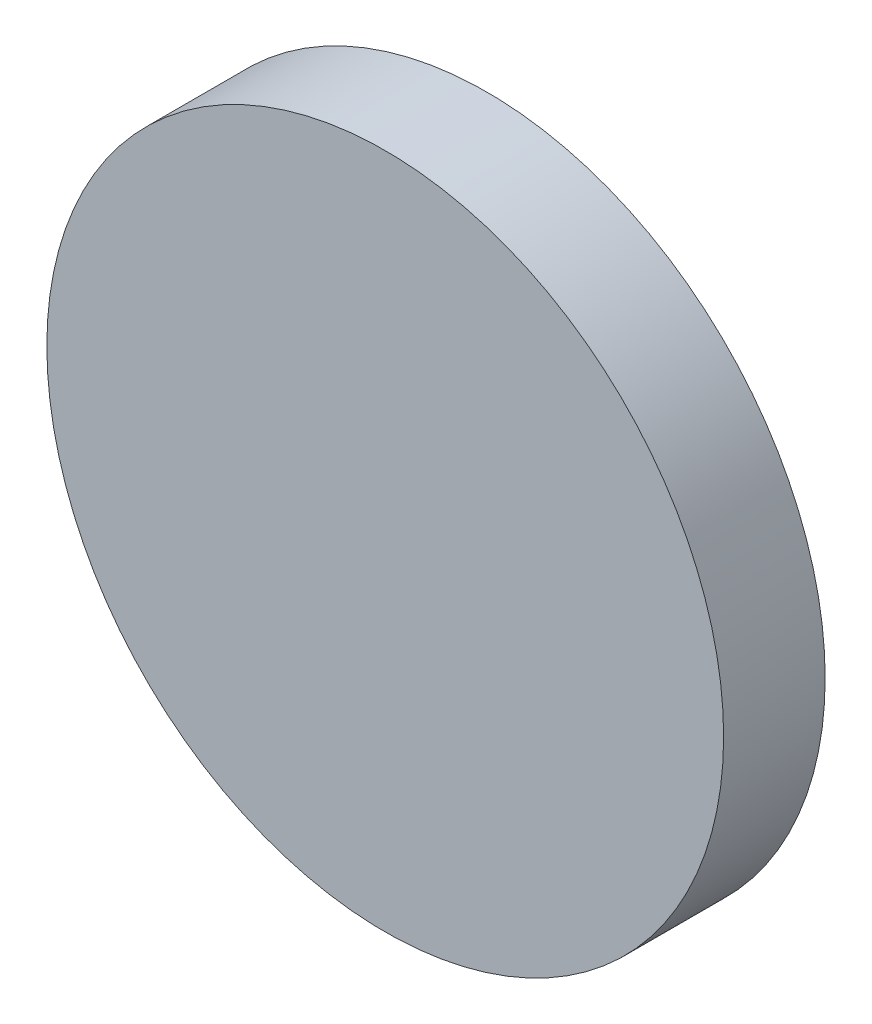
ISO-10303-21;
HEADER;
FILE_DESCRIPTION(('STEP AP214'),'2;1');
FILE_NAME('part.step','',(''),(''),'','','');
FILE_SCHEMA(('AUTOMOTIVE_DESIGN { 1 0 10303 214 1 1 1 1 }'));
ENDSEC;
DATA;
#1=APPLICATION_CONTEXT('core data for automotive mechanical design processes');
#2=APPLICATION_PROTOCOL_DEFINITION('international standard','automotive_design',2000,#1);
#3=PRODUCT_CONTEXT('',#1,'mechanical');
#4=PRODUCT('Part','Part','',(#3));
#5=PRODUCT_RELATED_PRODUCT_CATEGORY('part','',(#4));
#6=PRODUCT_DEFINITION_FORMATION('','',#4);
#7=PRODUCT_DEFINITION_CONTEXT('part definition',#1,'design');
#8=PRODUCT_DEFINITION('design','',#6,#7);
#9=PRODUCT_DEFINITION_SHAPE('','',#8);
#10=(LENGTH_UNIT() NAMED_UNIT(*) SI_UNIT(.MILLI.,.METRE.));
#11=(NAMED_UNIT(*) PLANE_ANGLE_UNIT() SI_UNIT($,.RADIAN.));
#12=(NAMED_UNIT(*) SI_UNIT($,.STERADIAN.) SOLID_ANGLE_UNIT());
#13=UNCERTAINTY_MEASURE_WITH_UNIT(LENGTH_MEASURE(1.E-05),#10,'distance_accuracy_value','');
#14=(GEOMETRIC_REPRESENTATION_CONTEXT(3) GLOBAL_UNCERTAINTY_ASSIGNED_CONTEXT((#13)) GLOBAL_UNIT_ASSIGNED_CONTEXT((#10,
#11,#12)) REPRESENTATION_CONTEXT('',''));
#15=CARTESIAN_POINT('',(0.,0.,0.));
#16=DIRECTION('',(0.,0.,1.));
#17=DIRECTION('',(1.,0.,0.));
#18=AXIS2_PLACEMENT_3D('',#15,#16,#17);
#19=CARTESIAN_POINT('',(-1.66533453693773E-13,0.,3.));
#20=DIRECTION('',(0.,0.,-1.));
#21=DIRECTION('',(-1.00000000000002,0.,0.));
#22=AXIS2_PLACEMENT_3D('',#19,#20,#21);
#23=CYLINDRICAL_SURFACE('',#22,10.);
#24=CARTESIAN_POINT('',(-1.66533453693773E-13,0.,3.));
#25=DIRECTION('',(0.,0.,1.));
#26=DIRECTION('',(1.00000000000002,0.,0.));
#27=AXIS2_PLACEMENT_3D('',#24,#25,#26);
#28=CIRCLE('',#27,10.);
#29=CARTESIAN_POINT('',(10.0000000000001,0.,3.));
#30=VERTEX_POINT('',#29);
#31=EDGE_CURVE('E10',#30,#30,#28,.T.);
#32=ORIENTED_EDGE('',*,*,#31,.F.);
#33=EDGE_LOOP('',(#32));
#34=FACE_BOUND('',#33,.T.);
#35=CARTESIAN_POINT('',(0.,0.,0.));
#36=DIRECTION('',(0.,0.,1.));
#37=DIRECTION('',(1.00000000000002,0.,0.));
#38=AXIS2_PLACEMENT_3D('',#35,#36,#37);
#39=CIRCLE('',#38,10.);
#40=CARTESIAN_POINT('',(10.0000000000002,0.,0.));
#41=VERTEX_POINT('',#40);
#42=EDGE_CURVE('E42',#41,#41,#39,.T.);
#43=ORIENTED_EDGE('',*,*,#42,.T.);
#44=EDGE_LOOP('',(#43));
#45=FACE_BOUND('',#44,.T.);
#46=ADVANCED_FACE('F39',(#34,#45),#23,.T.);
#47=CARTESIAN_POINT('',(-1.66533453693773E-13,0.,3.));
#48=DIRECTION('',(0.,0.,1.));
#49=DIRECTION('',(1.00000000000002,0.,0.));
#50=AXIS2_PLACEMENT_3D('',#47,#48,#49);
#51=PLANE('',#50);
#52=ORIENTED_EDGE('',*,*,#31,.T.);
#53=EDGE_LOOP('',(#52));
#54=FACE_BOUND('',#53,.T.);
#55=ADVANCED_FACE('F54',(#54),#51,.T.);
#56=CARTESIAN_POINT('',(0.,0.,0.));
#57=DIRECTION('',(0.,0.,1.));
#58=DIRECTION('',(1.00000000000002,0.,0.));
#59=AXIS2_PLACEMENT_3D('',#56,#57,#58);
#60=PLANE('',#59);
#61=ORIENTED_EDGE('',*,*,#42,.F.);
#62=EDGE_LOOP('',(#61));
#63=FACE_BOUND('',#62,.T.);
#64=ADVANCED_FACE('F52',(#63),#60,.F.);
#65=CLOSED_SHELL('',(#46,#55,#64));
#66=MANIFOLD_SOLID_BREP('B2',#65);
#67=ADVANCED_BREP_SHAPE_REPRESENTATION('',(#18,#66),#14);
#68=SHAPE_DEFINITION_REPRESENTATION(#9,#67);
ENDSEC;
END-ISO-10303-21;
